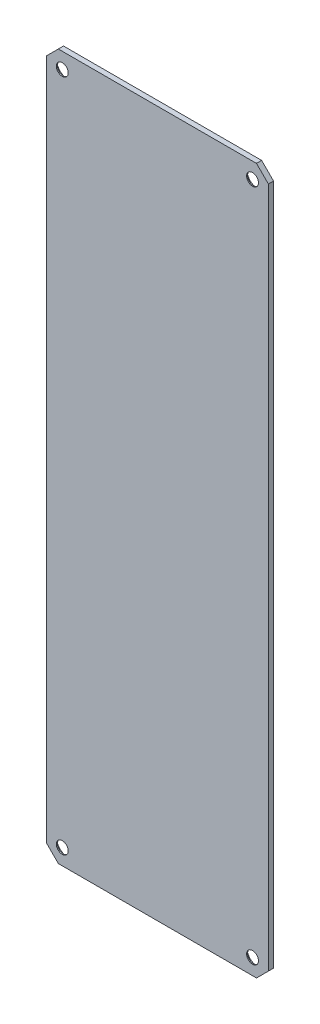
ISO-10303-21;
HEADER;
FILE_DESCRIPTION(('STEP AP214'),'2;1');
FILE_NAME('part.step','',(''),(''),'','','');
FILE_SCHEMA(('AUTOMOTIVE_DESIGN { 1 0 10303 214 1 1 1 1 }'));
ENDSEC;
DATA;
#1=APPLICATION_CONTEXT('core data for automotive mechanical design processes');
#2=APPLICATION_PROTOCOL_DEFINITION('international standard','automotive_design',2000,#1);
#3=PRODUCT_CONTEXT('',#1,'mechanical');
#4=PRODUCT('Part','Part','',(#3));
#5=PRODUCT_RELATED_PRODUCT_CATEGORY('part','',(#4));
#6=PRODUCT_DEFINITION_FORMATION('','',#4);
#7=PRODUCT_DEFINITION_CONTEXT('part definition',#1,'design');
#8=PRODUCT_DEFINITION('design','',#6,#7);
#9=PRODUCT_DEFINITION_SHAPE('','',#8);
#10=(LENGTH_UNIT() NAMED_UNIT(*) SI_UNIT(.MILLI.,.METRE.));
#11=(NAMED_UNIT(*) PLANE_ANGLE_UNIT() SI_UNIT($,.RADIAN.));
#12=(NAMED_UNIT(*) SI_UNIT($,.STERADIAN.) SOLID_ANGLE_UNIT());
#13=UNCERTAINTY_MEASURE_WITH_UNIT(LENGTH_MEASURE(1.E-05),#10,'distance_accuracy_value','');
#14=(GEOMETRIC_REPRESENTATION_CONTEXT(3) GLOBAL_UNCERTAINTY_ASSIGNED_CONTEXT((#13)) GLOBAL_UNIT_ASSIGNED_CONTEXT((#10,
#11,#12)) REPRESENTATION_CONTEXT('',''));
#15=CARTESIAN_POINT('',(0.,0.,0.));
#16=DIRECTION('',(0.,0.,1.));
#17=DIRECTION('',(1.,0.,0.));
#18=AXIS2_PLACEMENT_3D('',#15,#16,#17);
#19=CARTESIAN_POINT('',(4.,174.,-0.7));
#20=DIRECTION('',(0.,0.,1.));
#21=DIRECTION('',(1.,0.,0.));
#22=AXIS2_PLACEMENT_3D('',#19,#20,#21);
#23=CYLINDRICAL_SURFACE('',#22,2.667);
#24=CARTESIAN_POINT('',(4.,174.,0.));
#25=DIRECTION('',(0.,0.,-1.));
#26=DIRECTION('',(-1.,0.,0.));
#27=AXIS2_PLACEMENT_3D('',#24,#25,#26);
#28=CIRCLE('',#27,2.667);
#29=CARTESIAN_POINT('',(1.333,174.,0.));
#30=VERTEX_POINT('',#29);
#31=EDGE_CURVE('E196',#30,#30,#28,.T.);
#32=ORIENTED_EDGE('',*,*,#31,.T.);
#33=EDGE_LOOP('',(#32));
#34=FACE_BOUND('',#33,.T.);
#35=CARTESIAN_POINT('',(4.,174.,1.046));
#36=DIRECTION('',(0.,0.,1.));
#37=DIRECTION('',(1.,0.,0.));
#38=AXIS2_PLACEMENT_3D('',#35,#36,#37);
#39=CIRCLE('',#38,2.667);
#40=CARTESIAN_POINT('',(6.667,174.,1.046));
#41=VERTEX_POINT('',#40);
#42=EDGE_CURVE('E11',#41,#41,#39,.F.);
#43=ORIENTED_EDGE('',*,*,#42,.F.);
#44=EDGE_LOOP('',(#43));
#45=FACE_BOUND('',#44,.T.);
#46=ADVANCED_FACE('F45',(#34,#45),#23,.F.);
#47=CARTESIAN_POINT('',(51.9999999999999,4.,-0.7));
#48=DIRECTION('',(0.,0.,1.));
#49=DIRECTION('',(1.,0.,0.));
#50=AXIS2_PLACEMENT_3D('',#47,#48,#49);
#51=CYLINDRICAL_SURFACE('',#50,2.667);
#52=CARTESIAN_POINT('',(51.9999999999999,4.,0.));
#53=DIRECTION('',(0.,0.,-1.));
#54=DIRECTION('',(-1.,0.,0.));
#55=AXIS2_PLACEMENT_3D('',#52,#53,#54);
#56=CIRCLE('',#55,2.667);
#57=CARTESIAN_POINT('',(49.3329999999999,4.,0.));
#58=VERTEX_POINT('',#57);
#59=EDGE_CURVE('E205',#58,#58,#56,.T.);
#60=ORIENTED_EDGE('',*,*,#59,.T.);
#61=EDGE_LOOP('',(#60));
#62=FACE_BOUND('',#61,.T.);
#63=CARTESIAN_POINT('',(51.9999999999999,4.,1.046));
#64=DIRECTION('',(0.,0.,1.));
#65=DIRECTION('',(1.,0.,0.));
#66=AXIS2_PLACEMENT_3D('',#63,#64,#65);
#67=CIRCLE('',#66,2.667);
#68=CARTESIAN_POINT('',(54.6669999999999,4.,1.046));
#69=VERTEX_POINT('',#68);
#70=EDGE_CURVE('E55',#69,#69,#67,.F.);
#71=ORIENTED_EDGE('',*,*,#70,.F.);
#72=EDGE_LOOP('',(#71));
#73=FACE_BOUND('',#72,.T.);
#74=ADVANCED_FACE('F217',(#62,#73),#51,.F.);
#75=CARTESIAN_POINT('',(0.,3.,1.3));
#76=DIRECTION('',(1.,0.,0.));
#77=DIRECTION('',(0.,0.,-1.));
#78=AXIS2_PLACEMENT_3D('',#75,#76,#77);
#79=PLANE('',#78);
#80=DIRECTION('',(0.,-1.,0.));
#81=VECTOR('',#80,1.);
#82=CARTESIAN_POINT('',(0.,3.,0.));
#83=LINE('',#82,#81);
#84=CARTESIAN_POINT('',(0.,175.,0.));
#85=VERTEX_POINT('',#84);
#86=CARTESIAN_POINT('',(0.,3.,0.));
#87=VERTEX_POINT('',#86);
#88=EDGE_CURVE('E151',#85,#87,#83,.T.);
#89=ORIENTED_EDGE('',*,*,#88,.T.);
#90=DIRECTION('',(0.,0.,-1.));
#91=VECTOR('',#90,1.);
#92=CARTESIAN_POINT('',(0.,3.,1.3));
#93=LINE('',#92,#91);
#94=CARTESIAN_POINT('',(0.,3.,1.3));
#95=VERTEX_POINT('',#94);
#96=EDGE_CURVE('E193',#95,#87,#93,.T.);
#97=ORIENTED_EDGE('',*,*,#96,.F.);
#98=DIRECTION('',(0.,-1.,0.));
#99=VECTOR('',#98,1.);
#100=CARTESIAN_POINT('',(0.,3.,1.3));
#101=LINE('',#100,#99);
#102=CARTESIAN_POINT('',(0.,175.,1.3));
#103=VERTEX_POINT('',#102);
#104=EDGE_CURVE('E174',#103,#95,#101,.T.);
#105=ORIENTED_EDGE('',*,*,#104,.F.);
#106=DIRECTION('',(0.,0.,-1.));
#107=VECTOR('',#106,1.);
#108=CARTESIAN_POINT('',(0.,175.,1.3));
#109=LINE('',#108,#107);
#110=EDGE_CURVE('E147',#103,#85,#109,.T.);
#111=ORIENTED_EDGE('',*,*,#110,.T.);
#112=EDGE_LOOP('',(#89,#97,#105,#111));
#113=FACE_BOUND('',#112,.T.);
#114=ADVANCED_FACE('F47',(#113),#79,.F.);
#115=CARTESIAN_POINT('',(0.,3.,1.3));
#116=DIRECTION('',(0.707106781186548,0.707106781186548,0.));
#117=DIRECTION('',(-0.707106781186548,0.707106781186548,0.));
#118=AXIS2_PLACEMENT_3D('',#115,#116,#117);
#119=PLANE('',#118);
#120=DIRECTION('',(0.707106781186548,-0.707106781186548,0.));
#121=VECTOR('',#120,1.);
#122=CARTESIAN_POINT('',(0.,3.,0.));
#123=LINE('',#122,#121);
#124=CARTESIAN_POINT('',(3.,0.,0.));
#125=VERTEX_POINT('',#124);
#126=EDGE_CURVE('E155',#87,#125,#123,.T.);
#127=ORIENTED_EDGE('',*,*,#126,.T.);
#128=DIRECTION('',(0.,0.,-1.));
#129=VECTOR('',#128,1.);
#130=CARTESIAN_POINT('',(3.,0.,1.3));
#131=LINE('',#130,#129);
#132=CARTESIAN_POINT('',(3.,0.,1.3));
#133=VERTEX_POINT('',#132);
#134=EDGE_CURVE('E189',#133,#125,#131,.T.);
#135=ORIENTED_EDGE('',*,*,#134,.F.);
#136=DIRECTION('',(0.707106781186548,-0.707106781186548,0.));
#137=VECTOR('',#136,1.);
#138=CARTESIAN_POINT('',(0.,3.,1.3));
#139=LINE('',#138,#137);
#140=EDGE_CURVE('E107',#95,#133,#139,.T.);
#141=ORIENTED_EDGE('',*,*,#140,.F.);
#142=ORIENTED_EDGE('',*,*,#96,.T.);
#143=EDGE_LOOP('',(#127,#135,#141,#142));
#144=FACE_BOUND('',#143,.T.);
#145=ADVANCED_FACE('F224',(#144),#119,.F.);
#146=CARTESIAN_POINT('',(3.,0.,1.3));
#147=DIRECTION('',(0.,1.,0.));
#148=DIRECTION('',(0.,0.,1.));
#149=AXIS2_PLACEMENT_3D('',#146,#147,#148);
#150=PLANE('',#149);
#151=DIRECTION('',(1.,0.,0.));
#152=VECTOR('',#151,1.);
#153=CARTESIAN_POINT('',(3.,0.,0.));
#154=LINE('',#153,#152);
#155=CARTESIAN_POINT('',(53.,0.,0.));
#156=VERTEX_POINT('',#155);
#157=EDGE_CURVE('E159',#125,#156,#154,.T.);
#158=ORIENTED_EDGE('',*,*,#157,.T.);
#159=DIRECTION('',(0.,0.,-1.));
#160=VECTOR('',#159,1.);
#161=CARTESIAN_POINT('',(53.,0.,1.3));
#162=LINE('',#161,#160);
#163=CARTESIAN_POINT('',(53.,0.,1.3));
#164=VERTEX_POINT('',#163);
#165=EDGE_CURVE('E185',#164,#156,#162,.T.);
#166=ORIENTED_EDGE('',*,*,#165,.F.);
#167=DIRECTION('',(1.,0.,0.));
#168=VECTOR('',#167,1.);
#169=CARTESIAN_POINT('',(3.,0.,1.3));
#170=LINE('',#169,#168);
#171=EDGE_CURVE('E269',#133,#164,#170,.T.);
#172=ORIENTED_EDGE('',*,*,#171,.F.);
#173=ORIENTED_EDGE('',*,*,#134,.T.);
#174=EDGE_LOOP('',(#158,#166,#172,#173));
#175=FACE_BOUND('',#174,.T.);
#176=ADVANCED_FACE('F257',(#175),#150,.F.);
#177=CARTESIAN_POINT('',(53.,0.,1.3));
#178=DIRECTION('',(-0.707106781186547,0.707106781186548,0.));
#179=DIRECTION('',(-0.707106781186548,-0.707106781186547,0.));
#180=AXIS2_PLACEMENT_3D('',#177,#178,#179);
#181=PLANE('',#180);
#182=DIRECTION('',(0.707106781186548,0.707106781186547,0.));
#183=VECTOR('',#182,1.);
#184=CARTESIAN_POINT('',(53.,0.,0.));
#185=LINE('',#184,#183);
#186=CARTESIAN_POINT('',(56.,3.,0.));
#187=VERTEX_POINT('',#186);
#188=EDGE_CURVE('E162',#156,#187,#185,.T.);
#189=ORIENTED_EDGE('',*,*,#188,.T.);
#190=DIRECTION('',(0.,0.,-1.));
#191=VECTOR('',#190,1.);
#192=CARTESIAN_POINT('',(56.,3.,1.3));
#193=LINE('',#192,#191);
#194=CARTESIAN_POINT('',(56.,3.,1.3));
#195=VERTEX_POINT('',#194);
#196=EDGE_CURVE('E181',#195,#187,#193,.T.);
#197=ORIENTED_EDGE('',*,*,#196,.F.);
#198=DIRECTION('',(0.707106781186548,0.707106781186547,0.));
#199=VECTOR('',#198,1.);
#200=CARTESIAN_POINT('',(53.,0.,1.3));
#201=LINE('',#200,#199);
#202=EDGE_CURVE('E275',#164,#195,#201,.T.);
#203=ORIENTED_EDGE('',*,*,#202,.F.);
#204=ORIENTED_EDGE('',*,*,#165,.T.);
#205=EDGE_LOOP('',(#189,#197,#203,#204));
#206=FACE_BOUND('',#205,.T.);
#207=ADVANCED_FACE('F253',(#206),#181,.F.);
#208=CARTESIAN_POINT('',(56.,3.,1.3));
#209=DIRECTION('',(-1.,0.,0.));
#210=DIRECTION('',(0.,-1.,0.));
#211=AXIS2_PLACEMENT_3D('',#208,#209,#210);
#212=PLANE('',#211);
#213=DIRECTION('',(0.,1.,0.));
#214=VECTOR('',#213,1.);
#215=CARTESIAN_POINT('',(56.,3.,0.));
#216=LINE('',#215,#214);
#217=CARTESIAN_POINT('',(56.,175.,0.));
#218=VERTEX_POINT('',#217);
#219=EDGE_CURVE('E165',#187,#218,#216,.T.);
#220=ORIENTED_EDGE('',*,*,#219,.T.);
#221=DIRECTION('',(0.,0.,-1.));
#222=VECTOR('',#221,1.);
#223=CARTESIAN_POINT('',(56.,175.,1.3));
#224=LINE('',#223,#222);
#225=CARTESIAN_POINT('',(56.,175.,1.3));
#226=VERTEX_POINT('',#225);
#227=EDGE_CURVE('E138',#226,#218,#224,.T.);
#228=ORIENTED_EDGE('',*,*,#227,.F.);
#229=DIRECTION('',(0.,1.,0.));
#230=VECTOR('',#229,1.);
#231=CARTESIAN_POINT('',(56.,3.,1.3));
#232=LINE('',#231,#230);
#233=EDGE_CURVE('E127',#195,#226,#232,.T.);
#234=ORIENTED_EDGE('',*,*,#233,.F.);
#235=ORIENTED_EDGE('',*,*,#196,.T.);
#236=EDGE_LOOP('',(#220,#228,#234,#235));
#237=FACE_BOUND('',#236,.T.);
#238=ADVANCED_FACE('F250',(#237),#212,.F.);
#239=CARTESIAN_POINT('',(53.,178.,1.3));
#240=DIRECTION('',(-0.707106781186548,-0.707106781186548,0.));
#241=DIRECTION('',(0.707106781186548,-0.707106781186548,0.));
#242=AXIS2_PLACEMENT_3D('',#239,#240,#241);
#243=PLANE('',#242);
#244=DIRECTION('',(-0.707106781186547,0.707106781186547,0.));
#245=VECTOR('',#244,1.);
#246=CARTESIAN_POINT('',(53.,178.,0.));
#247=LINE('',#246,#245);
#248=CARTESIAN_POINT('',(53.,178.,0.));
#249=VERTEX_POINT('',#248);
#250=EDGE_CURVE('E136',#218,#249,#247,.T.);
#251=ORIENTED_EDGE('',*,*,#250,.T.);
#252=DIRECTION('',(0.,0.,-1.));
#253=VECTOR('',#252,1.);
#254=CARTESIAN_POINT('',(53.,178.,1.3));
#255=LINE('',#254,#253);
#256=CARTESIAN_POINT('',(53.,178.,1.3));
#257=VERTEX_POINT('',#256);
#258=EDGE_CURVE('E133',#257,#249,#255,.T.);
#259=ORIENTED_EDGE('',*,*,#258,.F.);
#260=DIRECTION('',(-0.707106781186547,0.707106781186547,0.));
#261=VECTOR('',#260,1.);
#262=CARTESIAN_POINT('',(53.,178.,1.3));
#263=LINE('',#262,#261);
#264=EDGE_CURVE('E120',#226,#257,#263,.T.);
#265=ORIENTED_EDGE('',*,*,#264,.F.);
#266=ORIENTED_EDGE('',*,*,#227,.T.);
#267=EDGE_LOOP('',(#251,#259,#265,#266));
#268=FACE_BOUND('',#267,.T.);
#269=ADVANCED_FACE('F134',(#268),#243,.F.);
#270=CARTESIAN_POINT('',(2.99999999999997,178.,1.3));
#271=DIRECTION('',(0.,-1.,0.));
#272=DIRECTION('',(0.,0.,-1.));
#273=AXIS2_PLACEMENT_3D('',#270,#271,#272);
#274=PLANE('',#273);
#275=DIRECTION('',(-1.,0.,0.));
#276=VECTOR('',#275,1.);
#277=CARTESIAN_POINT('',(2.99999999999997,178.,0.));
#278=LINE('',#277,#276);
#279=CARTESIAN_POINT('',(2.99999999999997,178.,0.));
#280=VERTEX_POINT('',#279);
#281=EDGE_CURVE('E92',#249,#280,#278,.T.);
#282=ORIENTED_EDGE('',*,*,#281,.T.);
#283=DIRECTION('',(0.,0.,-1.));
#284=VECTOR('',#283,1.);
#285=CARTESIAN_POINT('',(2.99999999999997,178.,1.3));
#286=LINE('',#285,#284);
#287=CARTESIAN_POINT('',(2.99999999999997,178.,1.3));
#288=VERTEX_POINT('',#287);
#289=EDGE_CURVE('E139',#288,#280,#286,.T.);
#290=ORIENTED_EDGE('',*,*,#289,.F.);
#291=DIRECTION('',(-1.,0.,0.));
#292=VECTOR('',#291,1.);
#293=CARTESIAN_POINT('',(2.99999999999997,178.,1.3));
#294=LINE('',#293,#292);
#295=EDGE_CURVE('E125',#257,#288,#294,.T.);
#296=ORIENTED_EDGE('',*,*,#295,.F.);
#297=ORIENTED_EDGE('',*,*,#258,.T.);
#298=EDGE_LOOP('',(#282,#290,#296,#297));
#299=FACE_BOUND('',#298,.T.);
#300=ADVANCED_FACE('F141',(#299),#274,.F.);
#301=CARTESIAN_POINT('',(0.,175.,1.3));
#302=DIRECTION('',(0.707106781186552,-0.707106781186543,0.));
#303=DIRECTION('',(0.707106781186543,0.707106781186552,0.));
#304=AXIS2_PLACEMENT_3D('',#301,#302,#303);
#305=PLANE('',#304);
#306=DIRECTION('',(-0.707106781186543,-0.707106781186552,0.));
#307=VECTOR('',#306,1.);
#308=CARTESIAN_POINT('',(0.,175.,0.));
#309=LINE('',#308,#307);
#310=EDGE_CURVE('E98',#280,#85,#309,.T.);
#311=ORIENTED_EDGE('',*,*,#310,.T.);
#312=ORIENTED_EDGE('',*,*,#110,.F.);
#313=DIRECTION('',(-0.707106781186543,-0.707106781186552,0.));
#314=VECTOR('',#313,1.);
#315=CARTESIAN_POINT('',(0.,175.,1.3));
#316=LINE('',#315,#314);
#317=EDGE_CURVE('E63',#288,#103,#316,.T.);
#318=ORIENTED_EDGE('',*,*,#317,.F.);
#319=ORIENTED_EDGE('',*,*,#289,.T.);
#320=EDGE_LOOP('',(#311,#312,#318,#319));
#321=FACE_BOUND('',#320,.T.);
#322=ADVANCED_FACE('F240',(#321),#305,.F.);
#323=CARTESIAN_POINT('',(0.,0.,1.3));
#324=DIRECTION('',(0.,0.,-1.));
#325=DIRECTION('',(-1.,0.,0.));
#326=AXIS2_PLACEMENT_3D('',#323,#324,#325);
#327=PLANE('',#326);
#328=ORIENTED_EDGE('',*,*,#104,.T.);
#329=ORIENTED_EDGE('',*,*,#140,.T.);
#330=ORIENTED_EDGE('',*,*,#171,.T.);
#331=ORIENTED_EDGE('',*,*,#202,.T.);
#332=ORIENTED_EDGE('',*,*,#233,.T.);
#333=ORIENTED_EDGE('',*,*,#264,.T.);
#334=ORIENTED_EDGE('',*,*,#295,.T.);
#335=ORIENTED_EDGE('',*,*,#317,.T.);
#336=EDGE_LOOP('',(#328,#329,#330,#331,#332,#333,#334,#335));
#337=FACE_BOUND('',#336,.T.);
#338=CARTESIAN_POINT('',(4.,4.,1.3));
#339=DIRECTION('',(0.,0.,1.));
#340=DIRECTION('',(-1.,0.,0.));
#341=AXIS2_PLACEMENT_3D('',#338,#339,#340);
#342=CIRCLE('',#341,1.5);
#343=CARTESIAN_POINT('',(2.5,4.,1.3));
#344=VERTEX_POINT('',#343);
#345=EDGE_CURVE('E295',#344,#344,#342,.T.);
#346=ORIENTED_EDGE('',*,*,#345,.F.);
#347=EDGE_LOOP('',(#346));
#348=FACE_BOUND('',#347,.T.);
#349=CARTESIAN_POINT('',(51.9999999999999,4.,1.3));
#350=DIRECTION('',(0.,0.,1.));
#351=DIRECTION('',(1.,0.,0.));
#352=AXIS2_PLACEMENT_3D('',#349,#350,#351);
#353=CIRCLE('',#352,1.5);
#354=CARTESIAN_POINT('',(53.4999999999999,4.,1.3));
#355=VERTEX_POINT('',#354);
#356=EDGE_CURVE('E307',#355,#355,#353,.T.);
#357=ORIENTED_EDGE('',*,*,#356,.F.);
#358=EDGE_LOOP('',(#357));
#359=FACE_BOUND('',#358,.T.);
#360=CARTESIAN_POINT('',(51.9999999999999,174.,1.3));
#361=DIRECTION('',(0.,0.,1.));
#362=DIRECTION('',(-1.,0.,0.));
#363=AXIS2_PLACEMENT_3D('',#360,#361,#362);
#364=CIRCLE('',#363,1.5);
#365=CARTESIAN_POINT('',(50.4999999999999,174.,1.3));
#366=VERTEX_POINT('',#365);
#367=EDGE_CURVE('E287',#366,#366,#364,.T.);
#368=ORIENTED_EDGE('',*,*,#367,.F.);
#369=EDGE_LOOP('',(#368));
#370=FACE_BOUND('',#369,.T.);
#371=CARTESIAN_POINT('',(4.,174.,1.3));
#372=DIRECTION('',(0.,0.,1.));
#373=DIRECTION('',(1.,0.,0.));
#374=AXIS2_PLACEMENT_3D('',#371,#372,#373);
#375=CIRCLE('',#374,1.5);
#376=CARTESIAN_POINT('',(5.5,174.,1.3));
#377=VERTEX_POINT('',#376);
#378=EDGE_CURVE('E284',#377,#377,#375,.T.);
#379=ORIENTED_EDGE('',*,*,#378,.F.);
#380=EDGE_LOOP('',(#379));
#381=FACE_BOUND('',#380,.T.);
#382=ADVANCED_FACE('F122',(#337,#348,#359,#370,#381),#327,.F.);
#383=CARTESIAN_POINT('',(0.,0.,0.));
#384=DIRECTION('',(0.,0.,-1.));
#385=DIRECTION('',(-1.,0.,0.));
#386=AXIS2_PLACEMENT_3D('',#383,#384,#385);
#387=PLANE('',#386);
#388=CARTESIAN_POINT('',(4.,4.,0.));
#389=DIRECTION('',(0.,0.,-1.));
#390=DIRECTION('',(-1.,0.,0.));
#391=AXIS2_PLACEMENT_3D('',#388,#389,#390);
#392=CIRCLE('',#391,2.667);
#393=CARTESIAN_POINT('',(1.333,4.,0.));
#394=VERTEX_POINT('',#393);
#395=EDGE_CURVE('E156',#394,#394,#392,.T.);
#396=ORIENTED_EDGE('',*,*,#395,.F.);
#397=EDGE_LOOP('',(#396));
#398=FACE_BOUND('',#397,.T.);
#399=ORIENTED_EDGE('',*,*,#59,.F.);
#400=EDGE_LOOP('',(#399));
#401=FACE_BOUND('',#400,.T.);
#402=CARTESIAN_POINT('',(51.9999999999999,174.,0.));
#403=DIRECTION('',(0.,0.,-1.));
#404=DIRECTION('',(-1.,0.,0.));
#405=AXIS2_PLACEMENT_3D('',#402,#403,#404);
#406=CIRCLE('',#405,2.667);
#407=CARTESIAN_POINT('',(49.3329999999999,174.,0.));
#408=VERTEX_POINT('',#407);
#409=EDGE_CURVE('E200',#408,#408,#406,.T.);
#410=ORIENTED_EDGE('',*,*,#409,.F.);
#411=EDGE_LOOP('',(#410));
#412=FACE_BOUND('',#411,.T.);
#413=ORIENTED_EDGE('',*,*,#31,.F.);
#414=EDGE_LOOP('',(#413));
#415=FACE_BOUND('',#414,.T.);
#416=ORIENTED_EDGE('',*,*,#88,.F.);
#417=ORIENTED_EDGE('',*,*,#310,.F.);
#418=ORIENTED_EDGE('',*,*,#281,.F.);
#419=ORIENTED_EDGE('',*,*,#250,.F.);
#420=ORIENTED_EDGE('',*,*,#219,.F.);
#421=ORIENTED_EDGE('',*,*,#188,.F.);
#422=ORIENTED_EDGE('',*,*,#157,.F.);
#423=ORIENTED_EDGE('',*,*,#126,.F.);
#424=EDGE_LOOP('',(#416,#417,#418,#419,#420,#421,#422,#423));
#425=FACE_BOUND('',#424,.T.);
#426=ADVANCED_FACE('F239',(#398,#401,#412,#415,#425),#387,.T.);
#427=CARTESIAN_POINT('',(51.9999999999999,174.,-0.7));
#428=DIRECTION('',(0.,0.,1.));
#429=DIRECTION('',(1.,0.,0.));
#430=AXIS2_PLACEMENT_3D('',#427,#428,#429);
#431=CYLINDRICAL_SURFACE('',#430,2.667);
#432=CARTESIAN_POINT('',(51.9999999999999,174.,1.046));
#433=DIRECTION('',(0.,0.,1.));
#434=DIRECTION('',(-1.,0.,0.));
#435=AXIS2_PLACEMENT_3D('',#432,#433,#434);
#436=CIRCLE('',#435,2.667);
#437=CARTESIAN_POINT('',(49.3329999999999,174.,1.046));
#438=VERTEX_POINT('',#437);
#439=EDGE_CURVE('E311',#438,#438,#436,.T.);
#440=ORIENTED_EDGE('',*,*,#439,.T.);
#441=EDGE_LOOP('',(#440));
#442=FACE_BOUND('',#441,.T.);
#443=ORIENTED_EDGE('',*,*,#409,.T.);
#444=EDGE_LOOP('',(#443));
#445=FACE_BOUND('',#444,.T.);
#446=ADVANCED_FACE('F230',(#442,#445),#431,.F.);
#447=CARTESIAN_POINT('',(4.,4.,-0.7));
#448=DIRECTION('',(0.,0.,1.));
#449=DIRECTION('',(1.,0.,0.));
#450=AXIS2_PLACEMENT_3D('',#447,#448,#449);
#451=CYLINDRICAL_SURFACE('',#450,2.667);
#452=CARTESIAN_POINT('',(4.,4.,1.046));
#453=DIRECTION('',(0.,0.,1.));
#454=DIRECTION('',(-1.,0.,0.));
#455=AXIS2_PLACEMENT_3D('',#452,#453,#454);
#456=CIRCLE('',#455,2.66700000000001);
#457=CARTESIAN_POINT('',(1.33299999999999,4.,1.046));
#458=VERTEX_POINT('',#457);
#459=EDGE_CURVE('E296',#458,#458,#456,.T.);
#460=ORIENTED_EDGE('',*,*,#459,.T.);
#461=EDGE_LOOP('',(#460));
#462=FACE_BOUND('',#461,.T.);
#463=ORIENTED_EDGE('',*,*,#395,.T.);
#464=EDGE_LOOP('',(#463));
#465=FACE_BOUND('',#464,.T.);
#466=ADVANCED_FACE('F232',(#462,#465),#451,.F.);
#467=CARTESIAN_POINT('',(4.,4.,1.046));
#468=DIRECTION('',(0.,0.,-1.));
#469=DIRECTION('',(-1.,0.,0.));
#470=AXIS2_PLACEMENT_3D('',#467,#468,#469);
#471=PLANE('',#470);
#472=CARTESIAN_POINT('',(4.,4.,1.046));
#473=DIRECTION('',(0.,0.,1.));
#474=DIRECTION('',(-1.,0.,0.));
#475=AXIS2_PLACEMENT_3D('',#472,#473,#474);
#476=CIRCLE('',#475,1.5);
#477=CARTESIAN_POINT('',(2.5,4.,1.046));
#478=VERTEX_POINT('',#477);
#479=EDGE_CURVE('E291',#478,#478,#476,.T.);
#480=ORIENTED_EDGE('',*,*,#479,.T.);
#481=EDGE_LOOP('',(#480));
#482=FACE_BOUND('',#481,.T.);
#483=ORIENTED_EDGE('',*,*,#459,.F.);
#484=EDGE_LOOP('',(#483));
#485=FACE_BOUND('',#484,.T.);
#486=ADVANCED_FACE('F234',(#482,#485),#471,.T.);
#487=CARTESIAN_POINT('',(4.,4.,1.046));
#488=DIRECTION('',(0.,0.,1.));
#489=DIRECTION('',(1.,0.,0.));
#490=AXIS2_PLACEMENT_3D('',#487,#488,#489);
#491=CYLINDRICAL_SURFACE('',#490,1.5);
#492=ORIENTED_EDGE('',*,*,#479,.F.);
#493=EDGE_LOOP('',(#492));
#494=FACE_BOUND('',#493,.T.);
#495=ORIENTED_EDGE('',*,*,#345,.T.);
#496=EDGE_LOOP('',(#495));
#497=FACE_BOUND('',#496,.T.);
#498=ADVANCED_FACE('F341',(#494,#497),#491,.F.);
#499=CARTESIAN_POINT('',(51.9999999999999,4.,1.046));
#500=DIRECTION('',(0.,0.,1.));
#501=DIRECTION('',(1.,0.,0.));
#502=AXIS2_PLACEMENT_3D('',#499,#500,#501);
#503=PLANE('',#502);
#504=CARTESIAN_POINT('',(51.9999999999999,4.,1.046));
#505=DIRECTION('',(0.,0.,1.));
#506=DIRECTION('',(1.,0.,0.));
#507=AXIS2_PLACEMENT_3D('',#504,#505,#506);
#508=CIRCLE('',#507,1.5);
#509=CARTESIAN_POINT('',(53.4999999999999,4.,1.046));
#510=VERTEX_POINT('',#509);
#511=EDGE_CURVE('E300',#510,#510,#508,.T.);
#512=ORIENTED_EDGE('',*,*,#511,.T.);
#513=EDGE_LOOP('',(#512));
#514=FACE_BOUND('',#513,.T.);
#515=ORIENTED_EDGE('',*,*,#70,.T.);
#516=EDGE_LOOP('',(#515));
#517=FACE_BOUND('',#516,.T.);
#518=ADVANCED_FACE('F215',(#514,#517),#503,.F.);
#519=CARTESIAN_POINT('',(51.9999999999999,4.,1.046));
#520=DIRECTION('',(0.,0.,1.));
#521=DIRECTION('',(1.,0.,0.));
#522=AXIS2_PLACEMENT_3D('',#519,#520,#521);
#523=CYLINDRICAL_SURFACE('',#522,1.5);
#524=ORIENTED_EDGE('',*,*,#511,.F.);
#525=EDGE_LOOP('',(#524));
#526=FACE_BOUND('',#525,.T.);
#527=ORIENTED_EDGE('',*,*,#356,.T.);
#528=EDGE_LOOP('',(#527));
#529=FACE_BOUND('',#528,.T.);
#530=ADVANCED_FACE('F328',(#526,#529),#523,.F.);
#531=CARTESIAN_POINT('',(51.9999999999999,174.,1.046));
#532=DIRECTION('',(0.,0.,-1.));
#533=DIRECTION('',(-1.,0.,0.));
#534=AXIS2_PLACEMENT_3D('',#531,#532,#533);
#535=PLANE('',#534);
#536=CARTESIAN_POINT('',(51.9999999999999,174.,1.046));
#537=DIRECTION('',(0.,0.,1.));
#538=DIRECTION('',(-1.,0.,0.));
#539=AXIS2_PLACEMENT_3D('',#536,#537,#538);
#540=CIRCLE('',#539,1.5);
#541=CARTESIAN_POINT('',(50.4999999999999,174.,1.046));
#542=VERTEX_POINT('',#541);
#543=EDGE_CURVE('E312',#542,#542,#540,.T.);
#544=ORIENTED_EDGE('',*,*,#543,.T.);
#545=EDGE_LOOP('',(#544));
#546=FACE_BOUND('',#545,.T.);
#547=ORIENTED_EDGE('',*,*,#439,.F.);
#548=EDGE_LOOP('',(#547));
#549=FACE_BOUND('',#548,.T.);
#550=ADVANCED_FACE('F325',(#546,#549),#535,.T.);
#551=CARTESIAN_POINT('',(51.9999999999999,174.,1.046));
#552=DIRECTION('',(0.,0.,1.));
#553=DIRECTION('',(1.,0.,0.));
#554=AXIS2_PLACEMENT_3D('',#551,#552,#553);
#555=CYLINDRICAL_SURFACE('',#554,1.5);
#556=ORIENTED_EDGE('',*,*,#543,.F.);
#557=EDGE_LOOP('',(#556));
#558=FACE_BOUND('',#557,.T.);
#559=ORIENTED_EDGE('',*,*,#367,.T.);
#560=EDGE_LOOP('',(#559));
#561=FACE_BOUND('',#560,.T.);
#562=ADVANCED_FACE('F327',(#558,#561),#555,.F.);
#563=CARTESIAN_POINT('',(4.,174.,1.046));
#564=DIRECTION('',(0.,0.,1.));
#565=DIRECTION('',(1.,0.,0.));
#566=AXIS2_PLACEMENT_3D('',#563,#564,#565);
#567=PLANE('',#566);
#568=CARTESIAN_POINT('',(4.,174.,1.046));
#569=DIRECTION('',(0.,0.,1.));
#570=DIRECTION('',(1.,0.,0.));
#571=AXIS2_PLACEMENT_3D('',#568,#569,#570);
#572=CIRCLE('',#571,1.5);
#573=CARTESIAN_POINT('',(5.5,174.,1.046));
#574=VERTEX_POINT('',#573);
#575=EDGE_CURVE('E201',#574,#574,#572,.T.);
#576=ORIENTED_EDGE('',*,*,#575,.T.);
#577=EDGE_LOOP('',(#576));
#578=FACE_BOUND('',#577,.T.);
#579=ORIENTED_EDGE('',*,*,#42,.T.);
#580=EDGE_LOOP('',(#579));
#581=FACE_BOUND('',#580,.T.);
#582=ADVANCED_FACE('F334',(#578,#581),#567,.F.);
#583=CARTESIAN_POINT('',(4.,174.,1.046));
#584=DIRECTION('',(0.,0.,1.));
#585=DIRECTION('',(1.,0.,0.));
#586=AXIS2_PLACEMENT_3D('',#583,#584,#585);
#587=CYLINDRICAL_SURFACE('',#586,1.5);
#588=ORIENTED_EDGE('',*,*,#575,.F.);
#589=EDGE_LOOP('',(#588));
#590=FACE_BOUND('',#589,.T.);
#591=ORIENTED_EDGE('',*,*,#378,.T.);
#592=EDGE_LOOP('',(#591));
#593=FACE_BOUND('',#592,.T.);
#594=ADVANCED_FACE('F350',(#590,#593),#587,.F.);
#595=CLOSED_SHELL('',(#46,#74,#114,#145,#176,#207,#238,#269,#300,#322,#382,#426,#446,#466,#486,
#498,#518,#530,#550,#562,#582,#594));
#596=MANIFOLD_SOLID_BREP('B2',#595);
#597=ADVANCED_BREP_SHAPE_REPRESENTATION('',(#18,#596),#14);
#598=SHAPE_DEFINITION_REPRESENTATION(#9,#597);
ENDSEC;
END-ISO-10303-21;
